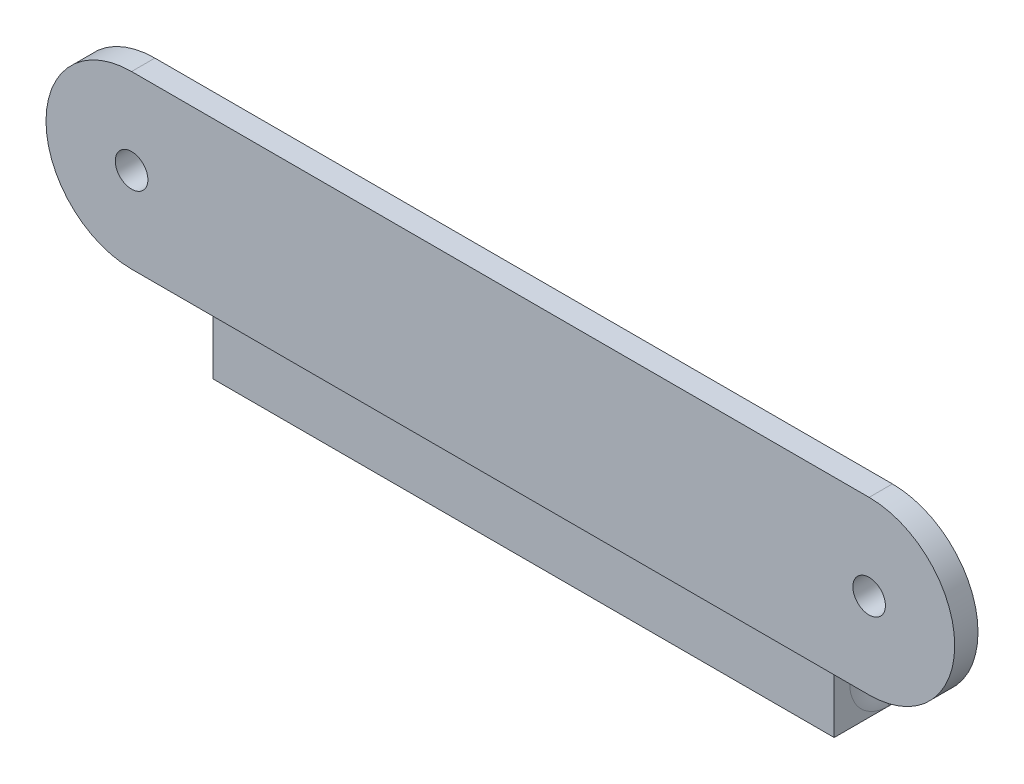
ISO-10303-21;
HEADER;
FILE_DESCRIPTION(('STEP AP214'),'2;1');
FILE_NAME('part.step','',(''),(''),'','','');
FILE_SCHEMA(('AUTOMOTIVE_DESIGN { 1 0 10303 214 1 1 1 1 }'));
ENDSEC;
DATA;
#1=APPLICATION_CONTEXT('core data for automotive mechanical design processes');
#2=APPLICATION_PROTOCOL_DEFINITION('international standard','automotive_design',2000,#1);
#3=PRODUCT_CONTEXT('',#1,'mechanical');
#4=PRODUCT('Part','Part','',(#3));
#5=PRODUCT_RELATED_PRODUCT_CATEGORY('part','',(#4));
#6=PRODUCT_DEFINITION_FORMATION('','',#4);
#7=PRODUCT_DEFINITION_CONTEXT('part definition',#1,'design');
#8=PRODUCT_DEFINITION('design','',#6,#7);
#9=PRODUCT_DEFINITION_SHAPE('','',#8);
#10=(LENGTH_UNIT() NAMED_UNIT(*) SI_UNIT(.MILLI.,.METRE.));
#11=(NAMED_UNIT(*) PLANE_ANGLE_UNIT() SI_UNIT($,.RADIAN.));
#12=(NAMED_UNIT(*) SI_UNIT($,.STERADIAN.) SOLID_ANGLE_UNIT());
#13=UNCERTAINTY_MEASURE_WITH_UNIT(LENGTH_MEASURE(1.E-05),#10,'distance_accuracy_value','');
#14=(GEOMETRIC_REPRESENTATION_CONTEXT(3) GLOBAL_UNCERTAINTY_ASSIGNED_CONTEXT((#13)) GLOBAL_UNIT_ASSIGNED_CONTEXT((#10,
#11,#12)) REPRESENTATION_CONTEXT('',''));
#15=CARTESIAN_POINT('',(0.,0.,0.));
#16=DIRECTION('',(0.,0.,1.));
#17=DIRECTION('',(1.,0.,0.));
#18=AXIS2_PLACEMENT_3D('',#15,#16,#17);
#19=CARTESIAN_POINT('',(7.5,3.97653194263363,-5.));
#20=DIRECTION('',(0.,0.,1.));
#21=DIRECTION('',(1.,0.,0.));
#22=AXIS2_PLACEMENT_3D('',#19,#20,#21);
#23=PLANE('',#22);
#24=DIRECTION('',(1.,0.,0.));
#25=VECTOR('',#24,1.);
#26=CARTESIAN_POINT('',(7.49999999999999,-16.0234680573664,-5.));
#27=LINE('',#26,#25);
#28=CARTESIAN_POINT('',(84.5,-16.0234680573664,-5.));
#29=VERTEX_POINT('',#28);
#30=CARTESIAN_POINT('',(10.5,-16.0234680573664,-5.));
#31=VERTEX_POINT('',#30);
#32=EDGE_CURVE('E422',#29,#31,#27,.F.);
#33=ORIENTED_EDGE('',*,*,#32,.T.);
#34=DIRECTION('',(0.,-1.,0.));
#35=VECTOR('',#34,1.);
#36=CARTESIAN_POINT('',(10.5,3.97653194263363,-5.));
#37=LINE('',#36,#35);
#38=CARTESIAN_POINT('',(10.5,-8.4733676553551,-5.));
#39=VERTEX_POINT('',#38);
#40=EDGE_CURVE('E269',#31,#39,#37,.F.);
#41=ORIENTED_EDGE('',*,*,#40,.T.);
#42=DIRECTION('',(-1.,0.,0.));
#43=VECTOR('',#42,1.);
#44=CARTESIAN_POINT('',(7.5,-8.4733676553551,-5.));
#45=LINE('',#44,#43);
#46=CARTESIAN_POINT('',(84.5,-8.4733676553551,-5.));
#47=VERTEX_POINT('',#46);
#48=EDGE_CURVE('E416',#39,#47,#45,.F.);
#49=ORIENTED_EDGE('',*,*,#48,.T.);
#50=DIRECTION('',(0.,-1.,0.));
#51=VECTOR('',#50,1.);
#52=CARTESIAN_POINT('',(84.5,-16.0234680573664,-5.));
#53=LINE('',#52,#51);
#54=EDGE_CURVE('E265',#47,#29,#53,.T.);
#55=ORIENTED_EDGE('',*,*,#54,.T.);
#56=EDGE_LOOP('',(#33,#41,#49,#55));
#57=FACE_BOUND('',#56,.T.);
#58=ADVANCED_FACE('F80',(#57),#23,.F.);
#59=CARTESIAN_POINT('',(0.,0.,0.));
#60=DIRECTION('',(0.,0.,1.));
#61=DIRECTION('',(1.,0.,0.));
#62=AXIS2_PLACEMENT_3D('',#59,#60,#61);
#63=PLANE('',#62);
#64=CARTESIAN_POINT('',(95.,0.,0.));
#65=DIRECTION('',(0.,0.,1.));
#66=DIRECTION('',(1.,0.,0.));
#67=AXIS2_PLACEMENT_3D('',#64,#65,#66);
#68=CIRCLE('',#67,2.1);
#69=CARTESIAN_POINT('',(97.1,0.,0.));
#70=VERTEX_POINT('',#69);
#71=EDGE_CURVE('E375',#70,#70,#68,.T.);
#72=ORIENTED_EDGE('',*,*,#71,.T.);
#73=EDGE_LOOP('',(#72));
#74=FACE_BOUND('',#73,.T.);
#75=CARTESIAN_POINT('',(0.,0.,0.));
#76=DIRECTION('',(0.,0.,1.));
#77=DIRECTION('',(1.,0.,0.));
#78=AXIS2_PLACEMENT_3D('',#75,#76,#77);
#79=CIRCLE('',#78,2.1);
#80=CARTESIAN_POINT('',(2.1,0.,0.));
#81=VERTEX_POINT('',#80);
#82=EDGE_CURVE('E374',#81,#81,#79,.T.);
#83=ORIENTED_EDGE('',*,*,#82,.T.);
#84=EDGE_LOOP('',(#83));
#85=FACE_BOUND('',#84,.T.);
#86=DIRECTION('',(0.,-1.,0.));
#87=VECTOR('',#86,1.);
#88=CARTESIAN_POINT('',(87.5,3.97653194263363,0.));
#89=LINE('',#88,#87);
#90=CARTESIAN_POINT('',(87.5,-0.990052881807212,0.));
#91=VERTEX_POINT('',#90);
#92=CARTESIAN_POINT('',(87.5,-11.0234680573664,0.));
#93=VERTEX_POINT('',#92);
#94=EDGE_CURVE('E230',#91,#93,#89,.T.);
#95=ORIENTED_EDGE('',*,*,#94,.F.);
#96=CARTESIAN_POINT('',(87.5,-0.990052881807212,0.));
#97=CARTESIAN_POINT('',(87.4999978357699,-0.885388434811943,0.));
#98=CARTESIAN_POINT('',(87.4986368556803,-0.780725418767247,0.));
#99=CARTESIAN_POINT('',(87.4929223767214,-0.571456976444541,0.));
#100=CARTESIAN_POINT('',(87.488568150698,-0.46685157034299,0.));
#101=CARTESIAN_POINT('',(87.4705582301355,-0.152481927429808,0.));
#102=CARTESIAN_POINT('',(87.4519510178105,0.057034911429657,0.));
#103=CARTESIAN_POINT('',(87.3987112343571,0.477334944762926,0.));
#104=CARTESIAN_POINT('',(87.3638382145852,0.688088596232203,0.));
#105=CARTESIAN_POINT('',(87.2751477611105,1.10529716785388,0.));
#106=CARTESIAN_POINT('',(87.2213641205256,1.31175906484374,0.));
#107=CARTESIAN_POINT('',(87.0922240855422,1.71570653796182,0.));
#108=CARTESIAN_POINT('',(87.0170877013878,1.91326099611243,0.));
#109=CARTESIAN_POINT('',(86.8418171367633,2.29648105755409,0.));
#110=CARTESIAN_POINT('',(86.7417671493507,2.48218410867043,0.));
#111=CARTESIAN_POINT('',(86.5307462210619,2.80853448437022,0.));
#112=CARTESIAN_POINT('',(86.4237662660151,2.95173439915594,0.));
#113=CARTESIAN_POINT('',(86.1879833044145,3.21916825162708,0.));
#114=CARTESIAN_POINT('',(86.0592015673537,3.34342045197706,0.));
#115=CARTESIAN_POINT('',(85.8143199222869,3.53802482955092,0.));
#116=CARTESIAN_POINT('',(85.7027987421686,3.61413033377444,0.));
#117=CARTESIAN_POINT('',(85.4688733819045,3.74706713090002,0.));
#118=CARTESIAN_POINT('',(85.3464950246791,3.80394268736963,0.));
#119=CARTESIAN_POINT('',(85.1626889004167,3.87002822495822,0.));
#120=CARTESIAN_POINT('',(85.104418302807,3.88831737329198,0.));
#121=CARTESIAN_POINT('',(84.9865350287314,3.91992479131274,0.));
#122=CARTESIAN_POINT('',(84.9269225743021,3.93324387707616,0.));
#123=CARTESIAN_POINT('',(84.8063571982769,3.95474832970471,0.));
#124=CARTESIAN_POINT('',(84.7453978926505,3.96289791582084,0.));
#125=CARTESIAN_POINT('',(84.622962146481,3.97379951399122,0.));
#126=CARTESIAN_POINT('',(84.5614854125712,3.97654822319585,0.));
#127=CARTESIAN_POINT('',(84.5,3.97653194263364,0.));
#128=B_SPLINE_CURVE_WITH_KNOTS('',3,(#96,#97,#98,#99,#100,#101,#102,#103,#104,#105,#106,#107,
#108,#109,#110,#111,#112,#113,#114,#115,#116,#117,#118,#119,#120,#121,#122,#123,#124,#125,#126,
#127),.UNSPECIFIED.,.F.,.F.,(4,2,2,2,2,2,2,2,2,2,2,2,2,2,2,4),(0.,0.313977332918058,
0.628030967823978,1.25853689293562,1.89867391138224,2.53767277607016,3.17031256837488,
3.8008427619457,4.33523607926266,4.86911102352178,5.2726572333943,5.67526813256238,
5.85831273595998,6.04132727048365,6.22559510375858,6.40997558906527),.UNSPECIFIED.);
#129=CARTESIAN_POINT('',(84.5,3.97653194263363,0.));
#130=VERTEX_POINT('',#129);
#131=EDGE_CURVE('E12',#91,#130,#128,.T.);
#132=ORIENTED_EDGE('',*,*,#131,.T.);
#133=DIRECTION('',(1.,0.,0.));
#134=VECTOR('',#133,1.);
#135=CARTESIAN_POINT('',(7.5,3.97653194263363,0.));
#136=LINE('',#135,#134);
#137=CARTESIAN_POINT('',(10.5,3.97653194263363,0.));
#138=VERTEX_POINT('',#137);
#139=EDGE_CURVE('E242',#138,#130,#136,.T.);
#140=ORIENTED_EDGE('',*,*,#139,.F.);
#141=CARTESIAN_POINT('',(10.5,3.97653194263363,0.));
#142=CARTESIAN_POINT('',(10.4346280941305,3.976552878203,0.));
#143=CARTESIAN_POINT('',(10.36926734203,3.97344335631516,0.));
#144=CARTESIAN_POINT('',(10.2391669558093,3.96112435441254,0.));
#145=CARTESIAN_POINT('',(10.1744269256911,3.95191906812451,0.));
#146=CARTESIAN_POINT('',(10.0465829676149,3.92766537860694,0.));
#147=CARTESIAN_POINT('',(9.98347014950594,3.91266376298809,0.));
#148=CARTESIAN_POINT('',(9.85884018727471,3.87711177757432,0.));
#149=CARTESIAN_POINT('',(9.79732323362944,3.85656074872963,0.));
#150=CARTESIAN_POINT('',(9.61611576856685,3.7872065771099,0.));
#151=CARTESIAN_POINT('',(9.49932653750546,3.73061515231337,0.));
#152=CARTESIAN_POINT('',(9.27590122625551,3.59995670385088,0.));
#153=CARTESIAN_POINT('',(9.16928700770215,3.52585319054401,0.));
#154=CARTESIAN_POINT('',(8.92892707369019,3.33267931520856,0.));
#155=CARTESIAN_POINT('',(8.80030347405651,3.20722991366819,0.));
#156=CARTESIAN_POINT('',(8.56497498639186,2.93747245374176,0.));
#157=CARTESIAN_POINT('',(8.45829756464008,2.79314112903026,0.));
#158=CARTESIAN_POINT('',(8.22006546672938,2.42065653351105,0.));
#159=CARTESIAN_POINT('',(8.10032213403637,2.1849475695553,0.));
#160=CARTESIAN_POINT('',(7.94892426099595,1.81972339907176,0.));
#161=CARTESIAN_POINT('',(7.90306435938328,1.69564006879937,0.));
#162=CARTESIAN_POINT('',(7.82001455712357,1.44459685056276,0.));
#163=CARTESIAN_POINT('',(7.78282271534122,1.3176376136332,0.));
#164=CARTESIAN_POINT('',(7.7030540847585,1.01065764139629,0.));
#165=CARTESIAN_POINT('',(7.66424383801065,0.829665804685379,0.));
#166=CARTESIAN_POINT('',(7.59998157122686,0.465225780973214,0.));
#167=CARTESIAN_POINT('',(7.57454111465207,0.281775607915672,0.));
#168=CARTESIAN_POINT('',(7.53558515652077,-0.0830579964119332,0.));
#169=CARTESIAN_POINT('',(7.52186664774623,-0.264420573741703,0.));
#170=CARTESIAN_POINT('',(7.50409724977459,-0.627235948229703,0.));
#171=CARTESIAN_POINT('',(7.50002534919829,-0.80868768669443,0.));
#172=CARTESIAN_POINT('',(7.5,-0.990052881807212,0.));
#173=B_SPLINE_CURVE_WITH_KNOTS('',3,(#141,#142,#143,#144,#145,#146,#147,#148,#149,#150,#151,
#152,#153,#154,#155,#156,#157,#158,#159,#160,#161,#162,#163,#164,#165,#166,#167,#168,#169,#170,
#171,#172),.UNSPECIFIED.,.F.,.F.,(4,2,2,2,2,2,2,2,2,2,2,2,2,2,2,4),(0.,0.196023588677815,
0.391912458157824,0.586252088782487,0.78061480939079,1.16800671442015,1.55621305153309,
2.09220388458158,2.6288614987173,3.41731074651983,3.81397497015025,4.21055027880116,
4.76526372819166,5.32045616001038,5.86582643192507,6.41000773055434),.UNSPECIFIED.);
#174=CARTESIAN_POINT('',(7.5,-0.990052881807212,0.));
#175=VERTEX_POINT('',#174);
#176=EDGE_CURVE('E89',#138,#175,#173,.T.);
#177=ORIENTED_EDGE('',*,*,#176,.T.);
#178=DIRECTION('',(0.,-1.,0.));
#179=VECTOR('',#178,1.);
#180=CARTESIAN_POINT('',(7.5,3.97653194263363,0.));
#181=LINE('',#180,#179);
#182=CARTESIAN_POINT('',(7.5,-11.0234680573664,0.));
#183=VERTEX_POINT('',#182);
#184=EDGE_CURVE('E225',#175,#183,#181,.T.);
#185=ORIENTED_EDGE('',*,*,#184,.T.);
#186=DIRECTION('',(1.,0.,0.));
#187=VECTOR('',#186,1.);
#188=CARTESIAN_POINT('',(0.,-11.0234680573664,0.));
#189=LINE('',#188,#187);
#190=CARTESIAN_POINT('',(0.,-11.0234680573664,0.));
#191=VERTEX_POINT('',#190);
#192=EDGE_CURVE('E398',#191,#183,#189,.T.);
#193=ORIENTED_EDGE('',*,*,#192,.F.);
#194=CARTESIAN_POINT('',(0.,0.,0.));
#195=DIRECTION('',(0.,0.,1.));
#196=DIRECTION('',(1.,0.,0.));
#197=AXIS2_PLACEMENT_3D('',#194,#195,#196);
#198=CIRCLE('',#197,11.0234680573664);
#199=CARTESIAN_POINT('',(0.,11.0234680573664,0.));
#200=VERTEX_POINT('',#199);
#201=EDGE_CURVE('E384',#200,#191,#198,.T.);
#202=ORIENTED_EDGE('',*,*,#201,.F.);
#203=DIRECTION('',(-1.,0.,0.));
#204=VECTOR('',#203,1.);
#205=CARTESIAN_POINT('',(0.,11.0234680573664,0.));
#206=LINE('',#205,#204);
#207=CARTESIAN_POINT('',(95.,11.0234680573664,0.));
#208=VERTEX_POINT('',#207);
#209=EDGE_CURVE('E388',#208,#200,#206,.T.);
#210=ORIENTED_EDGE('',*,*,#209,.F.);
#211=CARTESIAN_POINT('',(95.,0.,0.));
#212=DIRECTION('',(0.,0.,1.));
#213=DIRECTION('',(1.,0.,0.));
#214=AXIS2_PLACEMENT_3D('',#211,#212,#213);
#215=CIRCLE('',#214,11.0234680573664);
#216=CARTESIAN_POINT('',(95.,-11.0234680573664,0.));
#217=VERTEX_POINT('',#216);
#218=EDGE_CURVE('E401',#217,#208,#215,.T.);
#219=ORIENTED_EDGE('',*,*,#218,.F.);
#220=EDGE_CURVE('E397',#93,#217,#189,.T.);
#221=ORIENTED_EDGE('',*,*,#220,.F.);
#222=EDGE_LOOP('',(#95,#132,#140,#177,#185,#193,#202,#210,#219,#221));
#223=FACE_BOUND('',#222,.T.);
#224=ADVANCED_FACE('F283',(#74,#85,#223),#63,.F.);
#225=CARTESIAN_POINT('',(0.,0.,3.));
#226=DIRECTION('',(0.,0.,1.));
#227=DIRECTION('',(1.,0.,0.));
#228=AXIS2_PLACEMENT_3D('',#225,#226,#227);
#229=PLANE('',#228);
#230=CARTESIAN_POINT('',(0.,0.,3.));
#231=DIRECTION('',(0.,0.,1.));
#232=DIRECTION('',(1.,0.,0.));
#233=AXIS2_PLACEMENT_3D('',#230,#231,#232);
#234=CIRCLE('',#233,2.1);
#235=CARTESIAN_POINT('',(2.1,0.,3.));
#236=VERTEX_POINT('',#235);
#237=EDGE_CURVE('E365',#236,#236,#234,.T.);
#238=ORIENTED_EDGE('',*,*,#237,.F.);
#239=EDGE_LOOP('',(#238));
#240=FACE_BOUND('',#239,.T.);
#241=CARTESIAN_POINT('',(0.,0.,3.));
#242=DIRECTION('',(0.,0.,1.));
#243=DIRECTION('',(1.,0.,0.));
#244=AXIS2_PLACEMENT_3D('',#241,#242,#243);
#245=CIRCLE('',#244,11.0234680573664);
#246=CARTESIAN_POINT('',(0.,11.0234680573664,3.));
#247=VERTEX_POINT('',#246);
#248=CARTESIAN_POINT('',(0.,-11.0234680573664,3.));
#249=VERTEX_POINT('',#248);
#250=EDGE_CURVE('E369',#247,#249,#245,.T.);
#251=ORIENTED_EDGE('',*,*,#250,.T.);
#252=DIRECTION('',(1.,0.,0.));
#253=VECTOR('',#252,1.);
#254=CARTESIAN_POINT('',(0.,-11.0234680573664,3.));
#255=LINE('',#254,#253);
#256=CARTESIAN_POINT('',(95.,-11.0234680573664,3.));
#257=VERTEX_POINT('',#256);
#258=EDGE_CURVE('E387',#249,#257,#255,.T.);
#259=ORIENTED_EDGE('',*,*,#258,.T.);
#260=CARTESIAN_POINT('',(95.,0.,3.));
#261=DIRECTION('',(0.,0.,1.));
#262=DIRECTION('',(1.,0.,0.));
#263=AXIS2_PLACEMENT_3D('',#260,#261,#262);
#264=CIRCLE('',#263,11.0234680573664);
#265=CARTESIAN_POINT('',(95.,11.0234680573664,3.));
#266=VERTEX_POINT('',#265);
#267=EDGE_CURVE('E390',#257,#266,#264,.T.);
#268=ORIENTED_EDGE('',*,*,#267,.T.);
#269=DIRECTION('',(-1.,0.,0.));
#270=VECTOR('',#269,1.);
#271=CARTESIAN_POINT('',(0.,11.0234680573664,3.));
#272=LINE('',#271,#270);
#273=EDGE_CURVE('E392',#266,#247,#272,.T.);
#274=ORIENTED_EDGE('',*,*,#273,.T.);
#275=EDGE_LOOP('',(#251,#259,#268,#274));
#276=FACE_BOUND('',#275,.T.);
#277=CARTESIAN_POINT('',(95.,0.,3.));
#278=DIRECTION('',(0.,0.,1.));
#279=DIRECTION('',(1.,0.,0.));
#280=AXIS2_PLACEMENT_3D('',#277,#278,#279);
#281=CIRCLE('',#280,2.1);
#282=CARTESIAN_POINT('',(97.1,0.,3.));
#283=VERTEX_POINT('',#282);
#284=EDGE_CURVE('E373',#283,#283,#281,.T.);
#285=ORIENTED_EDGE('',*,*,#284,.F.);
#286=EDGE_LOOP('',(#285));
#287=FACE_BOUND('',#286,.T.);
#288=ADVANCED_FACE('F328',(#240,#276,#287),#229,.T.);
#289=CARTESIAN_POINT('',(0.,0.,3.));
#290=DIRECTION('',(0.,0.,-1.));
#291=DIRECTION('',(-1.,0.,0.));
#292=AXIS2_PLACEMENT_3D('',#289,#290,#291);
#293=CYLINDRICAL_SURFACE('',#292,11.0234680573664);
#294=ORIENTED_EDGE('',*,*,#201,.T.);
#295=DIRECTION('',(0.,0.,-1.));
#296=VECTOR('',#295,1.);
#297=CARTESIAN_POINT('',(0.,-11.0234680573664,3.));
#298=LINE('',#297,#296);
#299=EDGE_CURVE('E413',#249,#191,#298,.T.);
#300=ORIENTED_EDGE('',*,*,#299,.F.);
#301=ORIENTED_EDGE('',*,*,#250,.F.);
#302=DIRECTION('',(0.,0.,-1.));
#303=VECTOR('',#302,1.);
#304=CARTESIAN_POINT('',(0.,11.0234680573664,3.));
#305=LINE('',#304,#303);
#306=EDGE_CURVE('E394',#247,#200,#305,.T.);
#307=ORIENTED_EDGE('',*,*,#306,.T.);
#308=EDGE_LOOP('',(#294,#300,#301,#307));
#309=FACE_BOUND('',#308,.T.);
#310=ADVANCED_FACE('F354',(#309),#293,.T.);
#311=CARTESIAN_POINT('',(0.,-11.0234680573664,3.));
#312=DIRECTION('',(0.,1.,0.));
#313=DIRECTION('',(0.,0.,1.));
#314=AXIS2_PLACEMENT_3D('',#311,#312,#313);
#315=PLANE('',#314);
#316=ORIENTED_EDGE('',*,*,#192,.T.);
#317=EDGE_CURVE('E402',#183,#93,#189,.T.);
#318=ORIENTED_EDGE('',*,*,#317,.T.);
#319=ORIENTED_EDGE('',*,*,#220,.T.);
#320=DIRECTION('',(0.,0.,-1.));
#321=VECTOR('',#320,1.);
#322=CARTESIAN_POINT('',(95.,-11.0234680573664,3.));
#323=LINE('',#322,#321);
#324=EDGE_CURVE('E410',#257,#217,#323,.T.);
#325=ORIENTED_EDGE('',*,*,#324,.F.);
#326=ORIENTED_EDGE('',*,*,#258,.F.);
#327=ORIENTED_EDGE('',*,*,#299,.T.);
#328=EDGE_LOOP('',(#316,#318,#319,#325,#326,#327));
#329=FACE_BOUND('',#328,.T.);
#330=ADVANCED_FACE('F359',(#329),#315,.F.);
#331=CARTESIAN_POINT('',(95.,0.,3.));
#332=DIRECTION('',(0.,0.,-1.));
#333=DIRECTION('',(-1.,0.,0.));
#334=AXIS2_PLACEMENT_3D('',#331,#332,#333);
#335=CYLINDRICAL_SURFACE('',#334,11.0234680573664);
#336=ORIENTED_EDGE('',*,*,#218,.T.);
#337=DIRECTION('',(0.,0.,-1.));
#338=VECTOR('',#337,1.);
#339=CARTESIAN_POINT('',(95.,11.0234680573664,3.));
#340=LINE('',#339,#338);
#341=EDGE_CURVE('E407',#266,#208,#340,.T.);
#342=ORIENTED_EDGE('',*,*,#341,.F.);
#343=ORIENTED_EDGE('',*,*,#267,.F.);
#344=ORIENTED_EDGE('',*,*,#324,.T.);
#345=EDGE_LOOP('',(#336,#342,#343,#344));
#346=FACE_BOUND('',#345,.T.);
#347=ADVANCED_FACE('F535',(#346),#335,.T.);
#348=CARTESIAN_POINT('',(0.,11.0234680573664,3.));
#349=DIRECTION('',(0.,-1.,0.));
#350=DIRECTION('',(0.,0.,-1.));
#351=AXIS2_PLACEMENT_3D('',#348,#349,#350);
#352=PLANE('',#351);
#353=ORIENTED_EDGE('',*,*,#209,.T.);
#354=ORIENTED_EDGE('',*,*,#306,.F.);
#355=ORIENTED_EDGE('',*,*,#273,.F.);
#356=ORIENTED_EDGE('',*,*,#341,.T.);
#357=EDGE_LOOP('',(#353,#354,#355,#356));
#358=FACE_BOUND('',#357,.T.);
#359=ADVANCED_FACE('F351',(#358),#352,.F.);
#360=CARTESIAN_POINT('',(0.,0.,3.));
#361=DIRECTION('',(0.,0.,-1.));
#362=DIRECTION('',(-1.,0.,0.));
#363=AXIS2_PLACEMENT_3D('',#360,#361,#362);
#364=CYLINDRICAL_SURFACE('',#363,2.1);
#365=ORIENTED_EDGE('',*,*,#237,.T.);
#366=EDGE_LOOP('',(#365));
#367=FACE_BOUND('',#366,.T.);
#368=ORIENTED_EDGE('',*,*,#82,.F.);
#369=EDGE_LOOP('',(#368));
#370=FACE_BOUND('',#369,.T.);
#371=ADVANCED_FACE('F348',(#367,#370),#364,.F.);
#372=CARTESIAN_POINT('',(95.,0.,3.));
#373=DIRECTION('',(0.,0.,-1.));
#374=DIRECTION('',(-1.,0.,0.));
#375=AXIS2_PLACEMENT_3D('',#372,#373,#374);
#376=CYLINDRICAL_SURFACE('',#375,2.1);
#377=ORIENTED_EDGE('',*,*,#284,.T.);
#378=EDGE_LOOP('',(#377));
#379=FACE_BOUND('',#378,.T.);
#380=ORIENTED_EDGE('',*,*,#71,.F.);
#381=EDGE_LOOP('',(#380));
#382=FACE_BOUND('',#381,.T.);
#383=ADVANCED_FACE('F345',(#379,#382),#376,.F.);
#384=CARTESIAN_POINT('',(7.5,3.97653194263363,0.));
#385=DIRECTION('',(0.,0.,1.));
#386=DIRECTION('',(1.,0.,0.));
#387=AXIS2_PLACEMENT_3D('',#384,#385,#386);
#388=PLANE('',#387);
#389=ORIENTED_EDGE('',*,*,#317,.F.);
#390=CARTESIAN_POINT('',(7.5,-21.0234680573664,0.));
#391=VERTEX_POINT('',#390);
#392=EDGE_CURVE('E246',#183,#391,#181,.T.);
#393=ORIENTED_EDGE('',*,*,#392,.T.);
#394=DIRECTION('',(1.,0.,0.));
#395=VECTOR('',#394,1.);
#396=CARTESIAN_POINT('',(7.5,-21.0234680573664,0.));
#397=LINE('',#396,#395);
#398=CARTESIAN_POINT('',(87.5,-21.0234680573664,0.));
#399=VERTEX_POINT('',#398);
#400=EDGE_CURVE('E221',#391,#399,#397,.T.);
#401=ORIENTED_EDGE('',*,*,#400,.T.);
#402=EDGE_CURVE('E239',#93,#399,#89,.T.);
#403=ORIENTED_EDGE('',*,*,#402,.F.);
#404=EDGE_LOOP('',(#389,#393,#401,#403));
#405=FACE_BOUND('',#404,.T.);
#406=ADVANCED_FACE('F332',(#405),#388,.T.);
#407=CARTESIAN_POINT('',(87.5,0.,0.));
#408=DIRECTION('',(1.,0.,0.));
#409=DIRECTION('',(0.,0.,-1.));
#410=AXIS2_PLACEMENT_3D('',#407,#408,#409);
#411=PLANE('',#410);
#412=DIRECTION('',(0.,-1.,0.));
#413=VECTOR('',#412,1.);
#414=CARTESIAN_POINT('',(87.5,-8.4733676553551,-2.));
#415=LINE('',#414,#413);
#416=CARTESIAN_POINT('',(87.5,-16.0234680573664,-2.));
#417=VERTEX_POINT('',#416);
#418=CARTESIAN_POINT('',(87.5,-8.4733676553551,-2.));
#419=VERTEX_POINT('',#418);
#420=EDGE_CURVE('E97',#417,#419,#415,.F.);
#421=ORIENTED_EDGE('',*,*,#420,.T.);
#422=CARTESIAN_POINT('',(87.5,-8.4733676553551,13.));
#423=DIRECTION('',(1.,0.,0.));
#424=DIRECTION('',(0.,0.,-1.));
#425=AXIS2_PLACEMENT_3D('',#422,#423,#424);
#426=CIRCLE('',#425,15.);
#427=EDGE_CURVE('E264',#419,#91,#426,.T.);
#428=ORIENTED_EDGE('',*,*,#427,.T.);
#429=ORIENTED_EDGE('',*,*,#94,.T.);
#430=ORIENTED_EDGE('',*,*,#402,.T.);
#431=DIRECTION('',(0.,0.,-1.));
#432=VECTOR('',#431,1.);
#433=CARTESIAN_POINT('',(87.5,-21.0234680573664,0.));
#434=LINE('',#433,#432);
#435=CARTESIAN_POINT('',(87.5,-21.0234680573664,-7.));
#436=VERTEX_POINT('',#435);
#437=EDGE_CURVE('E220',#399,#436,#434,.T.);
#438=ORIENTED_EDGE('',*,*,#437,.T.);
#439=CARTESIAN_POINT('',(87.5,-16.0234680573664,-7.));
#440=DIRECTION('',(1.,0.,0.));
#441=DIRECTION('',(0.,0.,-1.));
#442=AXIS2_PLACEMENT_3D('',#439,#440,#441);
#443=CIRCLE('',#442,5.);
#444=EDGE_CURVE('E102',#436,#417,#443,.F.);
#445=ORIENTED_EDGE('',*,*,#444,.T.);
#446=EDGE_LOOP('',(#421,#428,#429,#430,#438,#445));
#447=FACE_BOUND('',#446,.T.);
#448=ADVANCED_FACE('F341',(#447),#411,.T.);
#449=CARTESIAN_POINT('',(7.5,0.,0.));
#450=DIRECTION('',(1.,0.,0.));
#451=DIRECTION('',(0.,0.,-1.));
#452=AXIS2_PLACEMENT_3D('',#449,#450,#451);
#453=PLANE('',#452);
#454=ORIENTED_EDGE('',*,*,#184,.F.);
#455=CARTESIAN_POINT('',(7.5,-8.4733676553551,13.));
#456=DIRECTION('',(1.,0.,0.));
#457=DIRECTION('',(0.,0.,-1.));
#458=AXIS2_PLACEMENT_3D('',#455,#456,#457);
#459=CIRCLE('',#458,15.);
#460=CARTESIAN_POINT('',(7.5,-8.4733676553551,-2.));
#461=VERTEX_POINT('',#460);
#462=EDGE_CURVE('E247',#175,#461,#459,.F.);
#463=ORIENTED_EDGE('',*,*,#462,.T.);
#464=DIRECTION('',(0.,-1.,0.));
#465=VECTOR('',#464,1.);
#466=CARTESIAN_POINT('',(7.5,0.,-2.));
#467=LINE('',#466,#465);
#468=CARTESIAN_POINT('',(7.5,-16.0234680573664,-2.));
#469=VERTEX_POINT('',#468);
#470=EDGE_CURVE('E424',#461,#469,#467,.T.);
#471=ORIENTED_EDGE('',*,*,#470,.T.);
#472=CARTESIAN_POINT('',(7.5,-16.0234680573664,-7.));
#473=DIRECTION('',(1.,0.,0.));
#474=DIRECTION('',(0.,0.,-1.));
#475=AXIS2_PLACEMENT_3D('',#472,#473,#474);
#476=CIRCLE('',#475,5.);
#477=CARTESIAN_POINT('',(7.5,-21.0234680573664,-7.));
#478=VERTEX_POINT('',#477);
#479=EDGE_CURVE('E453',#469,#478,#476,.T.);
#480=ORIENTED_EDGE('',*,*,#479,.T.);
#481=DIRECTION('',(0.,0.,-1.));
#482=VECTOR('',#481,1.);
#483=CARTESIAN_POINT('',(7.5,-21.0234680573664,0.));
#484=LINE('',#483,#482);
#485=EDGE_CURVE('E380',#391,#478,#484,.T.);
#486=ORIENTED_EDGE('',*,*,#485,.F.);
#487=ORIENTED_EDGE('',*,*,#392,.F.);
#488=EDGE_LOOP('',(#454,#463,#471,#480,#486,#487));
#489=FACE_BOUND('',#488,.T.);
#490=ADVANCED_FACE('F337',(#489),#453,.F.);
#491=CARTESIAN_POINT('',(7.5,-21.0234680573664,0.));
#492=DIRECTION('',(0.,-1.,0.));
#493=DIRECTION('',(0.,0.,-1.));
#494=AXIS2_PLACEMENT_3D('',#491,#492,#493);
#495=PLANE('',#494);
#496=CARTESIAN_POINT('',(17.5,-21.0234680573664,-10.1253008616925));
#497=DIRECTION('',(0.,-1.,0.));
#498=DIRECTION('',(0.,0.,-1.));
#499=AXIS2_PLACEMENT_3D('',#496,#497,#498);
#500=CIRCLE('',#499,1.6);
#501=CARTESIAN_POINT('',(17.5,-21.0234680573664,-11.7253008616925));
#502=VERTEX_POINT('',#501);
#503=EDGE_CURVE('E216',#502,#502,#500,.T.);
#504=ORIENTED_EDGE('',*,*,#503,.F.);
#505=EDGE_LOOP('',(#504));
#506=FACE_BOUND('',#505,.T.);
#507=CARTESIAN_POINT('',(77.5,-21.0234680573664,-10.1253008616925));
#508=DIRECTION('',(0.,-1.,0.));
#509=DIRECTION('',(0.,0.,-1.));
#510=AXIS2_PLACEMENT_3D('',#507,#508,#509);
#511=CIRCLE('',#510,1.59999999999999);
#512=CARTESIAN_POINT('',(77.5,-21.0234680573664,-11.7253008616925));
#513=VERTEX_POINT('',#512);
#514=EDGE_CURVE('E428',#513,#513,#511,.T.);
#515=ORIENTED_EDGE('',*,*,#514,.F.);
#516=EDGE_LOOP('',(#515));
#517=FACE_BOUND('',#516,.T.);
#518=ORIENTED_EDGE('',*,*,#437,.F.);
#519=ORIENTED_EDGE('',*,*,#400,.F.);
#520=ORIENTED_EDGE('',*,*,#485,.T.);
#521=CARTESIAN_POINT('',(7.5,-21.0234680573664,-13.));
#522=VERTEX_POINT('',#521);
#523=EDGE_CURVE('E215',#478,#522,#484,.T.);
#524=ORIENTED_EDGE('',*,*,#523,.T.);
#525=DIRECTION('',(-1.,0.,0.));
#526=VECTOR('',#525,1.);
#527=CARTESIAN_POINT('',(87.5,-21.0234680573664,-13.));
#528=LINE('',#527,#526);
#529=CARTESIAN_POINT('',(87.5,-21.0234680573664,-13.));
#530=VERTEX_POINT('',#529);
#531=EDGE_CURVE('E199',#530,#522,#528,.T.);
#532=ORIENTED_EDGE('',*,*,#531,.F.);
#533=EDGE_CURVE('E212',#436,#530,#434,.T.);
#534=ORIENTED_EDGE('',*,*,#533,.F.);
#535=EDGE_LOOP('',(#518,#519,#520,#524,#532,#534));
#536=FACE_BOUND('',#535,.T.);
#537=ADVANCED_FACE('F211',(#506,#517,#536),#495,.T.);
#538=CARTESIAN_POINT('',(7.5,-8.4733676553551,13.));
#539=DIRECTION('',(-1.,0.,0.));
#540=DIRECTION('',(0.,0.,1.));
#541=AXIS2_PLACEMENT_3D('',#538,#539,#540);
#542=CYLINDRICAL_SURFACE('',#541,18.);
#543=ORIENTED_EDGE('',*,*,#48,.F.);
#544=CARTESIAN_POINT('',(10.5,-8.4733676553551,13.));
#545=DIRECTION('',(1.,0.,0.));
#546=DIRECTION('',(0.,0.,-1.));
#547=AXIS2_PLACEMENT_3D('',#544,#545,#546);
#548=CIRCLE('',#547,18.);
#549=EDGE_CURVE('E251',#39,#138,#548,.T.);
#550=ORIENTED_EDGE('',*,*,#549,.T.);
#551=ORIENTED_EDGE('',*,*,#139,.T.);
#552=CARTESIAN_POINT('',(84.5,-8.4733676553551,13.));
#553=DIRECTION('',(1.,0.,0.));
#554=DIRECTION('',(0.,0.,-1.));
#555=AXIS2_PLACEMENT_3D('',#552,#553,#554);
#556=CIRCLE('',#555,18.);
#557=EDGE_CURVE('E249',#130,#47,#556,.F.);
#558=ORIENTED_EDGE('',*,*,#557,.T.);
#559=EDGE_LOOP('',(#543,#550,#551,#558));
#560=FACE_BOUND('',#559,.T.);
#561=ADVANCED_FACE('F336',(#560),#542,.T.);
#562=CARTESIAN_POINT('',(87.5,-18.0234680573664,-13.));
#563=DIRECTION('',(0.,-1.,0.));
#564=DIRECTION('',(0.,0.,-1.));
#565=AXIS2_PLACEMENT_3D('',#562,#563,#564);
#566=PLANE('',#565);
#567=CARTESIAN_POINT('',(17.5,-18.0234680573664,-10.1253008616925));
#568=DIRECTION('',(0.,-1.,0.));
#569=DIRECTION('',(0.,0.,-1.));
#570=AXIS2_PLACEMENT_3D('',#567,#568,#569);
#571=CIRCLE('',#570,1.6);
#572=CARTESIAN_POINT('',(17.5,-18.0234680573664,-11.7253008616925));
#573=VERTEX_POINT('',#572);
#574=EDGE_CURVE('E430',#573,#573,#571,.T.);
#575=ORIENTED_EDGE('',*,*,#574,.T.);
#576=EDGE_LOOP('',(#575));
#577=FACE_BOUND('',#576,.T.);
#578=CARTESIAN_POINT('',(77.5,-18.0234680573664,-10.1253008616925));
#579=DIRECTION('',(0.,-1.,0.));
#580=DIRECTION('',(0.,0.,-1.));
#581=AXIS2_PLACEMENT_3D('',#578,#579,#580);
#582=CIRCLE('',#581,1.59999999999999);
#583=CARTESIAN_POINT('',(77.5,-18.0234680573664,-11.7253008616925));
#584=VERTEX_POINT('',#583);
#585=EDGE_CURVE('E425',#584,#584,#582,.T.);
#586=ORIENTED_EDGE('',*,*,#585,.T.);
#587=EDGE_LOOP('',(#586));
#588=FACE_BOUND('',#587,.T.);
#589=DIRECTION('',(1.,0.,0.));
#590=VECTOR('',#589,1.);
#591=CARTESIAN_POINT('',(87.5,-18.0234680573664,-13.));
#592=LINE('',#591,#590);
#593=CARTESIAN_POINT('',(10.5,-18.0234680573664,-13.));
#594=VERTEX_POINT('',#593);
#595=CARTESIAN_POINT('',(84.5,-18.0234680573664,-13.));
#596=VERTEX_POINT('',#595);
#597=EDGE_CURVE('E202',#594,#596,#592,.T.);
#598=ORIENTED_EDGE('',*,*,#597,.F.);
#599=DIRECTION('',(0.,0.,1.));
#600=VECTOR('',#599,1.);
#601=CARTESIAN_POINT('',(10.5,-18.0234680573664,-13.));
#602=LINE('',#601,#600);
#603=CARTESIAN_POINT('',(10.5,-18.0234680573664,-7.));
#604=VERTEX_POINT('',#603);
#605=EDGE_CURVE('E207',#594,#604,#602,.T.);
#606=ORIENTED_EDGE('',*,*,#605,.T.);
#607=DIRECTION('',(1.,0.,0.));
#608=VECTOR('',#607,1.);
#609=CARTESIAN_POINT('',(87.5,-18.0234680573664,-7.));
#610=LINE('',#609,#608);
#611=CARTESIAN_POINT('',(84.5,-18.0234680573664,-7.));
#612=VERTEX_POINT('',#611);
#613=EDGE_CURVE('E419',#604,#612,#610,.T.);
#614=ORIENTED_EDGE('',*,*,#613,.T.);
#615=DIRECTION('',(0.,0.,1.));
#616=VECTOR('',#615,1.);
#617=CARTESIAN_POINT('',(84.5,-18.0234680573664,-13.));
#618=LINE('',#617,#616);
#619=EDGE_CURVE('E253',#612,#596,#618,.F.);
#620=ORIENTED_EDGE('',*,*,#619,.T.);
#621=EDGE_LOOP('',(#598,#606,#614,#620));
#622=FACE_BOUND('',#621,.T.);
#623=ADVANCED_FACE('F484',(#577,#588,#622),#566,.F.);
#624=CARTESIAN_POINT('',(0.,0.,-13.));
#625=DIRECTION('',(0.,0.,1.));
#626=DIRECTION('',(1.,0.,0.));
#627=AXIS2_PLACEMENT_3D('',#624,#625,#626);
#628=PLANE('',#627);
#629=ORIENTED_EDGE('',*,*,#531,.T.);
#630=CARTESIAN_POINT('',(10.5,-21.0234680573664,-13.));
#631=DIRECTION('',(0.,0.,1.));
#632=DIRECTION('',(1.,0.,0.));
#633=AXIS2_PLACEMENT_3D('',#630,#631,#632);
#634=CIRCLE('',#633,3.);
#635=EDGE_CURVE('E206',#522,#594,#634,.F.);
#636=ORIENTED_EDGE('',*,*,#635,.T.);
#637=ORIENTED_EDGE('',*,*,#597,.T.);
#638=CARTESIAN_POINT('',(84.5,-21.0234680573664,-13.));
#639=DIRECTION('',(0.,0.,1.));
#640=DIRECTION('',(1.,0.,0.));
#641=AXIS2_PLACEMENT_3D('',#638,#639,#640);
#642=CIRCLE('',#641,3.);
#643=EDGE_CURVE('E196',#596,#530,#642,.F.);
#644=ORIENTED_EDGE('',*,*,#643,.T.);
#645=EDGE_LOOP('',(#629,#636,#637,#644));
#646=FACE_BOUND('',#645,.T.);
#647=ADVANCED_FACE('F198',(#646),#628,.F.);
#648=CARTESIAN_POINT('',(87.5,-16.0234680573664,-7.));
#649=DIRECTION('',(-1.,0.,0.));
#650=DIRECTION('',(0.,0.,1.));
#651=AXIS2_PLACEMENT_3D('',#648,#649,#650);
#652=CYLINDRICAL_SURFACE('',#651,2.);
#653=ORIENTED_EDGE('',*,*,#613,.F.);
#654=CARTESIAN_POINT('',(10.5,-16.0234680573664,-7.));
#655=DIRECTION('',(1.,0.,0.));
#656=DIRECTION('',(0.,0.,-1.));
#657=AXIS2_PLACEMENT_3D('',#654,#655,#656);
#658=CIRCLE('',#657,2.);
#659=EDGE_CURVE('E258',#604,#31,#658,.F.);
#660=ORIENTED_EDGE('',*,*,#659,.T.);
#661=ORIENTED_EDGE('',*,*,#32,.F.);
#662=CARTESIAN_POINT('',(84.5,-16.0234680573664,-7.));
#663=DIRECTION('',(1.,0.,0.));
#664=DIRECTION('',(0.,0.,-1.));
#665=AXIS2_PLACEMENT_3D('',#662,#663,#664);
#666=CIRCLE('',#665,2.);
#667=EDGE_CURVE('E257',#29,#612,#666,.T.);
#668=ORIENTED_EDGE('',*,*,#667,.T.);
#669=EDGE_LOOP('',(#653,#660,#661,#668));
#670=FACE_BOUND('',#669,.T.);
#671=ADVANCED_FACE('F294',(#670),#652,.F.);
#672=CARTESIAN_POINT('',(77.5,-21.0235711350071,-10.1253008616925));
#673=DIRECTION('',(0.,1.,0.));
#674=DIRECTION('',(0.,0.,1.));
#675=AXIS2_PLACEMENT_3D('',#672,#673,#674);
#676=CYLINDRICAL_SURFACE('',#675,1.59999999999999);
#677=ORIENTED_EDGE('',*,*,#514,.T.);
#678=EDGE_LOOP('',(#677));
#679=FACE_BOUND('',#678,.T.);
#680=ORIENTED_EDGE('',*,*,#585,.F.);
#681=EDGE_LOOP('',(#680));
#682=FACE_BOUND('',#681,.T.);
#683=ADVANCED_FACE('F492',(#679,#682),#676,.F.);
#684=CARTESIAN_POINT('',(17.5,-21.0235711350071,-10.1253008616925));
#685=DIRECTION('',(0.,1.,0.));
#686=DIRECTION('',(0.,0.,1.));
#687=AXIS2_PLACEMENT_3D('',#684,#685,#686);
#688=CYLINDRICAL_SURFACE('',#687,1.6);
#689=ORIENTED_EDGE('',*,*,#503,.T.);
#690=EDGE_LOOP('',(#689));
#691=FACE_BOUND('',#690,.T.);
#692=ORIENTED_EDGE('',*,*,#574,.F.);
#693=EDGE_LOOP('',(#692));
#694=FACE_BOUND('',#693,.T.);
#695=ADVANCED_FACE('F305',(#691,#694),#688,.F.);
#696=CARTESIAN_POINT('',(10.5,-21.0234680573664,-13.));
#697=DIRECTION('',(0.,0.,1.));
#698=DIRECTION('',(1.,0.,0.));
#699=AXIS2_PLACEMENT_3D('',#696,#697,#698);
#700=CYLINDRICAL_SURFACE('',#699,3.);
#701=ORIENTED_EDGE('',*,*,#635,.F.);
#702=ORIENTED_EDGE('',*,*,#523,.F.);
#703=CARTESIAN_POINT('',(10.5,-21.0234680573664,-7.));
#704=DIRECTION('',(0.,0.,1.));
#705=DIRECTION('',(1.,0.,0.));
#706=AXIS2_PLACEMENT_3D('',#703,#704,#705);
#707=CIRCLE('',#706,3.);
#708=EDGE_CURVE('E429',#604,#478,#707,.T.);
#709=ORIENTED_EDGE('',*,*,#708,.F.);
#710=ORIENTED_EDGE('',*,*,#605,.F.);
#711=EDGE_LOOP('',(#701,#702,#709,#710));
#712=FACE_BOUND('',#711,.T.);
#713=ADVANCED_FACE('F302',(#712),#700,.T.);
#714=CARTESIAN_POINT('',(10.5,-16.0234680573664,-7.));
#715=DIRECTION('',(1.,0.,0.));
#716=DIRECTION('',(0.,0.,-1.));
#717=AXIS2_PLACEMENT_3D('',#714,#715,#716);
#718=TOROIDAL_SURFACE('',#717,5.,3.);
#719=ORIENTED_EDGE('',*,*,#708,.T.);
#720=ORIENTED_EDGE('',*,*,#479,.F.);
#721=CARTESIAN_POINT('',(10.5,-16.0234680573664,-2.));
#722=DIRECTION('',(0.,1.,0.));
#723=DIRECTION('',(0.,0.,1.));
#724=AXIS2_PLACEMENT_3D('',#721,#722,#723);
#725=CIRCLE('',#724,3.);
#726=EDGE_CURVE('E455',#31,#469,#725,.T.);
#727=ORIENTED_EDGE('',*,*,#726,.F.);
#728=ORIENTED_EDGE('',*,*,#659,.F.);
#729=EDGE_LOOP('',(#719,#720,#727,#728));
#730=FACE_BOUND('',#729,.T.);
#731=ADVANCED_FACE('F298',(#730),#718,.T.);
#732=CARTESIAN_POINT('',(10.5,0.,-2.));
#733=DIRECTION('',(0.,-1.,0.));
#734=DIRECTION('',(0.,0.,-1.));
#735=AXIS2_PLACEMENT_3D('',#732,#733,#734);
#736=CYLINDRICAL_SURFACE('',#735,3.);
#737=ORIENTED_EDGE('',*,*,#726,.T.);
#738=ORIENTED_EDGE('',*,*,#470,.F.);
#739=CARTESIAN_POINT('',(10.5,-8.4733676553551,-2.));
#740=DIRECTION('',(0.,1.,0.));
#741=DIRECTION('',(0.,0.,1.));
#742=AXIS2_PLACEMENT_3D('',#739,#740,#741);
#743=CIRCLE('',#742,3.);
#744=EDGE_CURVE('E457',#39,#461,#743,.T.);
#745=ORIENTED_EDGE('',*,*,#744,.F.);
#746=ORIENTED_EDGE('',*,*,#40,.F.);
#747=EDGE_LOOP('',(#737,#738,#745,#746));
#748=FACE_BOUND('',#747,.T.);
#749=ADVANCED_FACE('F292',(#748),#736,.T.);
#750=CARTESIAN_POINT('',(10.5,-8.4733676553551,13.));
#751=DIRECTION('',(1.,0.,0.));
#752=DIRECTION('',(0.,0.,-1.));
#753=AXIS2_PLACEMENT_3D('',#750,#751,#752);
#754=TOROIDAL_SURFACE('',#753,15.,3.);
#755=ORIENTED_EDGE('',*,*,#176,.F.);
#756=ORIENTED_EDGE('',*,*,#549,.F.);
#757=ORIENTED_EDGE('',*,*,#744,.T.);
#758=ORIENTED_EDGE('',*,*,#462,.F.);
#759=EDGE_LOOP('',(#755,#756,#757,#758));
#760=FACE_BOUND('',#759,.T.);
#761=ADVANCED_FACE('F287',(#760),#754,.T.);
#762=CARTESIAN_POINT('',(84.5,-21.0234680573664,0.));
#763=DIRECTION('',(0.,0.,-1.));
#764=DIRECTION('',(-1.,0.,0.));
#765=AXIS2_PLACEMENT_3D('',#762,#763,#764);
#766=CYLINDRICAL_SURFACE('',#765,3.);
#767=ORIENTED_EDGE('',*,*,#643,.F.);
#768=ORIENTED_EDGE('',*,*,#619,.F.);
#769=CARTESIAN_POINT('',(84.5,-21.0234680573664,-7.));
#770=DIRECTION('',(0.,0.,1.));
#771=DIRECTION('',(1.,0.,0.));
#772=AXIS2_PLACEMENT_3D('',#769,#770,#771);
#773=CIRCLE('',#772,3.);
#774=EDGE_CURVE('E84',#436,#612,#773,.T.);
#775=ORIENTED_EDGE('',*,*,#774,.F.);
#776=ORIENTED_EDGE('',*,*,#533,.T.);
#777=EDGE_LOOP('',(#767,#768,#775,#776));
#778=FACE_BOUND('',#777,.T.);
#779=ADVANCED_FACE('F82',(#778),#766,.T.);
#780=CARTESIAN_POINT('',(84.5,-16.0234680573664,-7.));
#781=DIRECTION('',(1.,0.,0.));
#782=DIRECTION('',(0.,0.,-1.));
#783=AXIS2_PLACEMENT_3D('',#780,#781,#782);
#784=TOROIDAL_SURFACE('',#783,5.,3.);
#785=ORIENTED_EDGE('',*,*,#774,.T.);
#786=ORIENTED_EDGE('',*,*,#667,.F.);
#787=CARTESIAN_POINT('',(84.5,-16.0234680573664,-2.));
#788=DIRECTION('',(0.,1.,0.));
#789=DIRECTION('',(0.,0.,1.));
#790=AXIS2_PLACEMENT_3D('',#787,#788,#789);
#791=CIRCLE('',#790,3.);
#792=EDGE_CURVE('E462',#417,#29,#791,.T.);
#793=ORIENTED_EDGE('',*,*,#792,.F.);
#794=ORIENTED_EDGE('',*,*,#444,.F.);
#795=EDGE_LOOP('',(#785,#786,#793,#794));
#796=FACE_BOUND('',#795,.T.);
#797=ADVANCED_FACE('F314',(#796),#784,.T.);
#798=CARTESIAN_POINT('',(84.5,3.97653194263363,-2.));
#799=DIRECTION('',(0.,1.,0.));
#800=DIRECTION('',(0.,0.,1.));
#801=AXIS2_PLACEMENT_3D('',#798,#799,#800);
#802=CYLINDRICAL_SURFACE('',#801,3.);
#803=ORIENTED_EDGE('',*,*,#792,.T.);
#804=ORIENTED_EDGE('',*,*,#54,.F.);
#805=CARTESIAN_POINT('',(84.5,-8.4733676553551,-2.));
#806=DIRECTION('',(0.,1.,0.));
#807=DIRECTION('',(0.,0.,1.));
#808=AXIS2_PLACEMENT_3D('',#805,#806,#807);
#809=CIRCLE('',#808,3.);
#810=EDGE_CURVE('E460',#419,#47,#809,.T.);
#811=ORIENTED_EDGE('',*,*,#810,.F.);
#812=ORIENTED_EDGE('',*,*,#420,.F.);
#813=EDGE_LOOP('',(#803,#804,#811,#812));
#814=FACE_BOUND('',#813,.T.);
#815=ADVANCED_FACE('F311',(#814),#802,.T.);
#816=CARTESIAN_POINT('',(84.5,-8.4733676553551,13.));
#817=DIRECTION('',(1.,0.,0.));
#818=DIRECTION('',(0.,0.,-1.));
#819=AXIS2_PLACEMENT_3D('',#816,#817,#818);
#820=TOROIDAL_SURFACE('',#819,15.,3.);
#821=ORIENTED_EDGE('',*,*,#810,.T.);
#822=ORIENTED_EDGE('',*,*,#557,.F.);
#823=ORIENTED_EDGE('',*,*,#131,.F.);
#824=ORIENTED_EDGE('',*,*,#427,.F.);
#825=EDGE_LOOP('',(#821,#822,#823,#824));
#826=FACE_BOUND('',#825,.T.);
#827=ADVANCED_FACE('F307',(#826),#820,.T.);
#828=CLOSED_SHELL('',(#58,#224,#288,#310,#330,#347,#359,#371,#383,#406,#448,#490,#537,#561,#623,
#647,#671,#683,#695,#713,#731,#749,#761,#779,#797,#815,#827));
#829=MANIFOLD_SOLID_BREP('B2',#828);
#830=ADVANCED_BREP_SHAPE_REPRESENTATION('',(#18,#829),#14);
#831=SHAPE_DEFINITION_REPRESENTATION(#9,#830);
ENDSEC;
END-ISO-10303-21;
